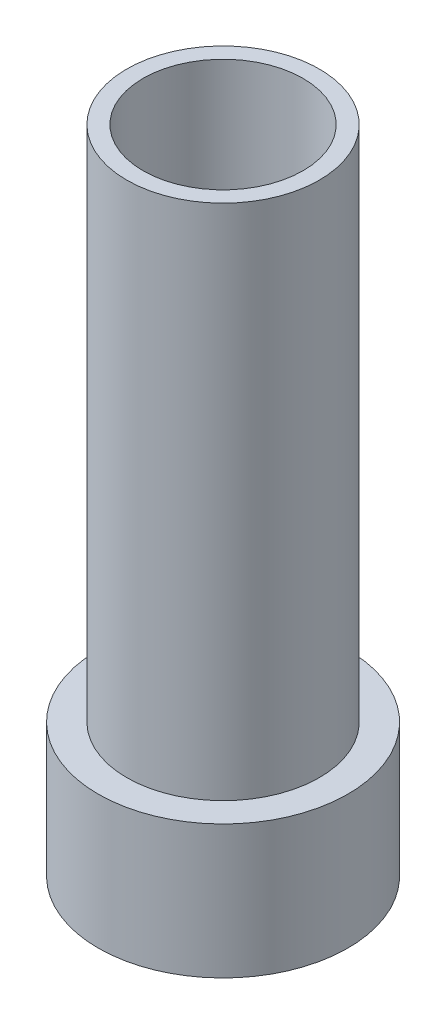
ISO-10303-21;
HEADER;
FILE_DESCRIPTION(('STEP AP214'),'2;1');
FILE_NAME('part.step','',(''),(''),'','','');
FILE_SCHEMA(('AUTOMOTIVE_DESIGN { 1 0 10303 214 1 1 1 1 }'));
ENDSEC;
DATA;
#1=APPLICATION_CONTEXT('core data for automotive mechanical design processes');
#2=APPLICATION_PROTOCOL_DEFINITION('international standard','automotive_design',2000,#1);
#3=PRODUCT_CONTEXT('',#1,'mechanical');
#4=PRODUCT('Part','Part','',(#3));
#5=PRODUCT_RELATED_PRODUCT_CATEGORY('part','',(#4));
#6=PRODUCT_DEFINITION_FORMATION('','',#4);
#7=PRODUCT_DEFINITION_CONTEXT('part definition',#1,'design');
#8=PRODUCT_DEFINITION('design','',#6,#7);
#9=PRODUCT_DEFINITION_SHAPE('','',#8);
#10=(LENGTH_UNIT() NAMED_UNIT(*) SI_UNIT(.MILLI.,.METRE.));
#11=(NAMED_UNIT(*) PLANE_ANGLE_UNIT() SI_UNIT($,.RADIAN.));
#12=(NAMED_UNIT(*) SI_UNIT($,.STERADIAN.) SOLID_ANGLE_UNIT());
#13=UNCERTAINTY_MEASURE_WITH_UNIT(LENGTH_MEASURE(1.E-05),#10,'distance_accuracy_value','');
#14=(GEOMETRIC_REPRESENTATION_CONTEXT(3) GLOBAL_UNCERTAINTY_ASSIGNED_CONTEXT((#13)) GLOBAL_UNIT_ASSIGNED_CONTEXT((#10,
#11,#12)) REPRESENTATION_CONTEXT('',''));
#15=CARTESIAN_POINT('',(0.,0.,0.));
#16=DIRECTION('',(0.,0.,1.));
#17=DIRECTION('',(1.,0.,0.));
#18=AXIS2_PLACEMENT_3D('',#15,#16,#17);
#19=CARTESIAN_POINT('',(0.,5.,0.));
#20=DIRECTION('',(0.,-1.,0.));
#21=DIRECTION('',(0.,0.,-1.));
#22=AXIS2_PLACEMENT_3D('',#19,#20,#21);
#23=CYLINDRICAL_SURFACE('',#22,4.68);
#24=CARTESIAN_POINT('',(0.,5.,0.));
#25=DIRECTION('',(0.,1.,0.));
#26=DIRECTION('',(0.,0.,1.));
#27=AXIS2_PLACEMENT_3D('',#24,#25,#26);
#28=CIRCLE('',#27,4.68);
#29=CARTESIAN_POINT('',(0.,5.,4.68));
#30=VERTEX_POINT('',#29);
#31=EDGE_CURVE('E36',#30,#30,#28,.T.);
#32=ORIENTED_EDGE('',*,*,#31,.F.);
#33=EDGE_LOOP('',(#32));
#34=FACE_BOUND('',#33,.T.);
#35=CARTESIAN_POINT('',(0.,0.,0.));
#36=DIRECTION('',(0.,1.,0.));
#37=DIRECTION('',(0.,0.,1.));
#38=AXIS2_PLACEMENT_3D('',#35,#36,#37);
#39=CIRCLE('',#38,4.68);
#40=CARTESIAN_POINT('',(0.,0.,4.68));
#41=VERTEX_POINT('',#40);
#42=EDGE_CURVE('E40',#41,#41,#39,.T.);
#43=ORIENTED_EDGE('',*,*,#42,.T.);
#44=EDGE_LOOP('',(#43));
#45=FACE_BOUND('',#44,.T.);
#46=ADVANCED_FACE('F30',(#34,#45),#23,.T.);
#47=CARTESIAN_POINT('',(0.,5.,0.));
#48=DIRECTION('',(0.,1.,0.));
#49=DIRECTION('',(0.,0.,1.));
#50=AXIS2_PLACEMENT_3D('',#47,#48,#49);
#51=PLANE('',#50);
#52=CARTESIAN_POINT('',(0.,5.,0.));
#53=DIRECTION('',(0.,1.,0.));
#54=DIRECTION('',(0.,0.,1.));
#55=AXIS2_PLACEMENT_3D('',#52,#53,#54);
#56=CIRCLE('',#55,3.61);
#57=CARTESIAN_POINT('',(0.,5.,3.61));
#58=VERTEX_POINT('',#57);
#59=EDGE_CURVE('E47',#58,#58,#56,.T.);
#60=ORIENTED_EDGE('',*,*,#59,.F.);
#61=EDGE_LOOP('',(#60));
#62=FACE_BOUND('',#61,.T.);
#63=ORIENTED_EDGE('',*,*,#31,.T.);
#64=EDGE_LOOP('',(#63));
#65=FACE_BOUND('',#64,.T.);
#66=ADVANCED_FACE('F70',(#62,#65),#51,.T.);
#67=CARTESIAN_POINT('',(0.,0.,0.));
#68=DIRECTION('',(0.,1.,0.));
#69=DIRECTION('',(0.,0.,1.));
#70=AXIS2_PLACEMENT_3D('',#67,#68,#69);
#71=PLANE('',#70);
#72=ORIENTED_EDGE('',*,*,#42,.F.);
#73=EDGE_LOOP('',(#72));
#74=FACE_BOUND('',#73,.T.);
#75=ADVANCED_FACE('F61',(#74),#71,.F.);
#76=CARTESIAN_POINT('',(0.,24.4,0.));
#77=DIRECTION('',(0.,1.,0.));
#78=DIRECTION('',(0.,0.,1.));
#79=AXIS2_PLACEMENT_3D('',#76,#77,#78);
#80=PLANE('',#79);
#81=CARTESIAN_POINT('',(0.,24.4,0.));
#82=DIRECTION('',(0.,1.,0.));
#83=DIRECTION('',(0.,0.,1.));
#84=AXIS2_PLACEMENT_3D('',#81,#82,#83);
#85=CIRCLE('',#84,3.61);
#86=CARTESIAN_POINT('',(0.,24.4,3.61));
#87=VERTEX_POINT('',#86);
#88=EDGE_CURVE('E45',#87,#87,#85,.T.);
#89=ORIENTED_EDGE('',*,*,#88,.T.);
#90=EDGE_LOOP('',(#89));
#91=FACE_BOUND('',#90,.T.);
#92=CARTESIAN_POINT('',(0.,24.4,0.));
#93=DIRECTION('',(0.,1.,0.));
#94=DIRECTION('',(0.,0.,1.));
#95=AXIS2_PLACEMENT_3D('',#92,#93,#94);
#96=CIRCLE('',#95,3.);
#97=CARTESIAN_POINT('',(0.,24.4,3.));
#98=VERTEX_POINT('',#97);
#99=EDGE_CURVE('E50',#98,#98,#96,.T.);
#100=ORIENTED_EDGE('',*,*,#99,.F.);
#101=EDGE_LOOP('',(#100));
#102=FACE_BOUND('',#101,.T.);
#103=ADVANCED_FACE('F58',(#91,#102),#80,.T.);
#104=CARTESIAN_POINT('',(0.,24.4,0.));
#105=DIRECTION('',(0.,-1.,0.));
#106=DIRECTION('',(0.,0.,-1.));
#107=AXIS2_PLACEMENT_3D('',#104,#105,#106);
#108=CYLINDRICAL_SURFACE('',#107,3.61);
#109=ORIENTED_EDGE('',*,*,#88,.F.);
#110=EDGE_LOOP('',(#109));
#111=FACE_BOUND('',#110,.T.);
#112=ORIENTED_EDGE('',*,*,#59,.T.);
#113=EDGE_LOOP('',(#112));
#114=FACE_BOUND('',#113,.T.);
#115=ADVANCED_FACE('F60',(#111,#114),#108,.T.);
#116=CARTESIAN_POINT('',(0.,24.4,0.));
#117=DIRECTION('',(0.,-1.,0.));
#118=DIRECTION('',(0.,0.,-1.));
#119=AXIS2_PLACEMENT_3D('',#116,#117,#118);
#120=CYLINDRICAL_SURFACE('',#119,3.);
#121=CARTESIAN_POINT('',(0.,19.05,0.));
#122=DIRECTION('',(0.,1.,0.));
#123=DIRECTION('',(0.,0.,1.));
#124=AXIS2_PLACEMENT_3D('',#121,#122,#123);
#125=CIRCLE('',#124,3.);
#126=CARTESIAN_POINT('',(0.,19.05,3.));
#127=VERTEX_POINT('',#126);
#128=EDGE_CURVE('E10',#127,#127,#125,.T.);
#129=ORIENTED_EDGE('',*,*,#128,.F.);
#130=EDGE_LOOP('',(#129));
#131=FACE_BOUND('',#130,.T.);
#132=ORIENTED_EDGE('',*,*,#99,.T.);
#133=EDGE_LOOP('',(#132));
#134=FACE_BOUND('',#133,.T.);
#135=ADVANCED_FACE('F56',(#131,#134),#120,.F.);
#136=CARTESIAN_POINT('',(0.,19.05,0.));
#137=DIRECTION('',(0.,1.,0.));
#138=DIRECTION('',(0.,0.,1.));
#139=AXIS2_PLACEMENT_3D('',#136,#137,#138);
#140=PLANE('',#139);
#141=ORIENTED_EDGE('',*,*,#128,.T.);
#142=EDGE_LOOP('',(#141));
#143=FACE_BOUND('',#142,.T.);
#144=ADVANCED_FACE('F115',(#143),#140,.T.);
#145=CLOSED_SHELL('',(#46,#66,#75,#103,#115,#135,#144));
#146=MANIFOLD_SOLID_BREP('B2',#145);
#147=ADVANCED_BREP_SHAPE_REPRESENTATION('',(#18,#146),#14);
#148=SHAPE_DEFINITION_REPRESENTATION(#9,#147);
ENDSEC;
END-ISO-10303-21;
